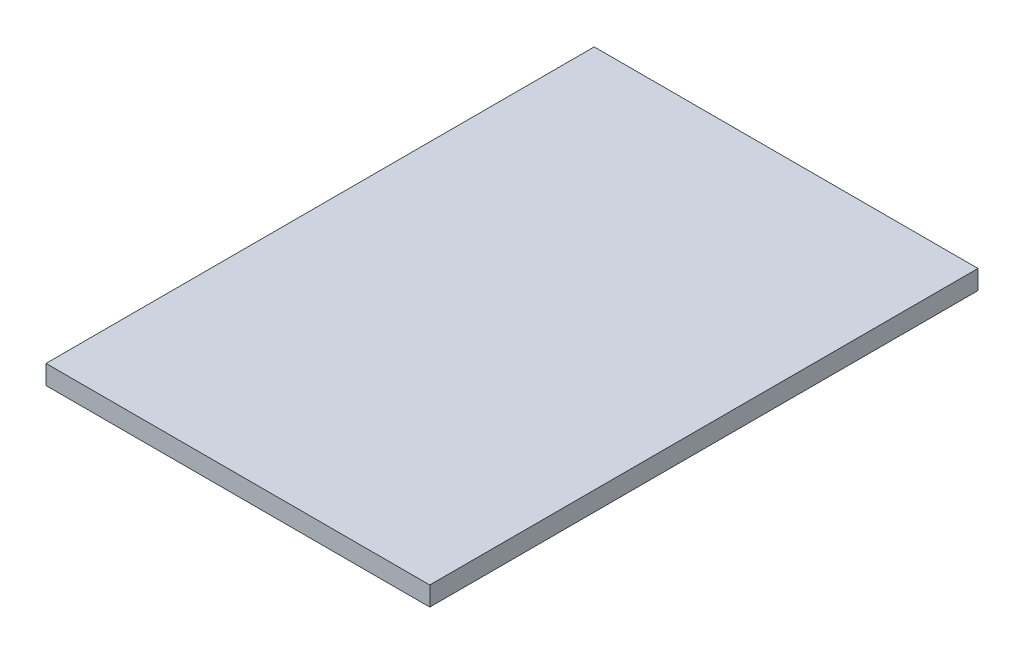
ISO-10303-21;
HEADER;
FILE_DESCRIPTION(('STEP AP214'),'2;1');
FILE_NAME('part.step','',(''),(''),'','','');
FILE_SCHEMA(('AUTOMOTIVE_DESIGN { 1 0 10303 214 1 1 1 1 }'));
ENDSEC;
DATA;
#1=APPLICATION_CONTEXT('core data for automotive mechanical design processes');
#2=APPLICATION_PROTOCOL_DEFINITION('international standard','automotive_design',2000,#1);
#3=PRODUCT_CONTEXT('',#1,'mechanical');
#4=PRODUCT('Part','Part','',(#3));
#5=PRODUCT_RELATED_PRODUCT_CATEGORY('part','',(#4));
#6=PRODUCT_DEFINITION_FORMATION('','',#4);
#7=PRODUCT_DEFINITION_CONTEXT('part definition',#1,'design');
#8=PRODUCT_DEFINITION('design','',#6,#7);
#9=PRODUCT_DEFINITION_SHAPE('','',#8);
#10=(LENGTH_UNIT() NAMED_UNIT(*) SI_UNIT(.MILLI.,.METRE.));
#11=(NAMED_UNIT(*) PLANE_ANGLE_UNIT() SI_UNIT($,.RADIAN.));
#12=(NAMED_UNIT(*) SI_UNIT($,.STERADIAN.) SOLID_ANGLE_UNIT());
#13=UNCERTAINTY_MEASURE_WITH_UNIT(LENGTH_MEASURE(1.E-05),#10,'distance_accuracy_value','');
#14=(GEOMETRIC_REPRESENTATION_CONTEXT(3) GLOBAL_UNCERTAINTY_ASSIGNED_CONTEXT((#13)) GLOBAL_UNIT_ASSIGNED_CONTEXT((#10,
#11,#12)) REPRESENTATION_CONTEXT('',''));
#15=CARTESIAN_POINT('',(0.,0.,0.));
#16=DIRECTION('',(0.,0.,1.));
#17=DIRECTION('',(1.,0.,0.));
#18=AXIS2_PLACEMENT_3D('',#15,#16,#17);
#19=CARTESIAN_POINT('',(700.,70.,1000.));
#20=DIRECTION('',(-1.,0.,0.));
#21=DIRECTION('',(0.,0.,1.));
#22=AXIS2_PLACEMENT_3D('',#19,#20,#21);
#23=PLANE('',#22);
#24=DIRECTION('',(0.,0.,-1.));
#25=VECTOR('',#24,1.);
#26=CARTESIAN_POINT('',(700.,0.,1000.));
#27=LINE('',#26,#25);
#28=CARTESIAN_POINT('',(700.,0.,1000.));
#29=VERTEX_POINT('',#28);
#30=CARTESIAN_POINT('',(700.,0.,-1000.));
#31=VERTEX_POINT('',#30);
#32=EDGE_CURVE('E80',#29,#31,#27,.T.);
#33=ORIENTED_EDGE('',*,*,#32,.T.);
#34=DIRECTION('',(0.,-1.,0.));
#35=VECTOR('',#34,1.);
#36=CARTESIAN_POINT('',(700.,70.,-1000.));
#37=LINE('',#36,#35);
#38=CARTESIAN_POINT('',(700.,70.,-1000.));
#39=VERTEX_POINT('',#38);
#40=EDGE_CURVE('E11',#39,#31,#37,.T.);
#41=ORIENTED_EDGE('',*,*,#40,.F.);
#42=DIRECTION('',(0.,0.,-1.));
#43=VECTOR('',#42,1.);
#44=CARTESIAN_POINT('',(700.,70.,1000.));
#45=LINE('',#44,#43);
#46=CARTESIAN_POINT('',(700.,70.,1000.));
#47=VERTEX_POINT('',#46);
#48=EDGE_CURVE('E68',#47,#39,#45,.T.);
#49=ORIENTED_EDGE('',*,*,#48,.F.);
#50=DIRECTION('',(0.,-1.,0.));
#51=VECTOR('',#50,1.);
#52=CARTESIAN_POINT('',(700.,70.,1000.));
#53=LINE('',#52,#51);
#54=EDGE_CURVE('E76',#47,#29,#53,.T.);
#55=ORIENTED_EDGE('',*,*,#54,.T.);
#56=EDGE_LOOP('',(#33,#41,#49,#55));
#57=FACE_BOUND('',#56,.T.);
#58=ADVANCED_FACE('F17',(#57),#23,.F.);
#59=CARTESIAN_POINT('',(-700.,70.,-1000.));
#60=DIRECTION('',(0.,0.,1.));
#61=DIRECTION('',(1.,0.,0.));
#62=AXIS2_PLACEMENT_3D('',#59,#60,#61);
#63=PLANE('',#62);
#64=DIRECTION('',(-1.,0.,0.));
#65=VECTOR('',#64,1.);
#66=CARTESIAN_POINT('',(-700.,0.,-1000.));
#67=LINE('',#66,#65);
#68=CARTESIAN_POINT('',(-700.,0.,-1000.));
#69=VERTEX_POINT('',#68);
#70=EDGE_CURVE('E72',#31,#69,#67,.T.);
#71=ORIENTED_EDGE('',*,*,#70,.T.);
#72=DIRECTION('',(0.,-1.,0.));
#73=VECTOR('',#72,1.);
#74=CARTESIAN_POINT('',(-700.,70.,-1000.));
#75=LINE('',#74,#73);
#76=CARTESIAN_POINT('',(-700.,70.,-1000.));
#77=VERTEX_POINT('',#76);
#78=EDGE_CURVE('E25',#77,#69,#75,.T.);
#79=ORIENTED_EDGE('',*,*,#78,.F.);
#80=DIRECTION('',(-1.,0.,0.));
#81=VECTOR('',#80,1.);
#82=CARTESIAN_POINT('',(-700.,70.,-1000.));
#83=LINE('',#82,#81);
#84=EDGE_CURVE('E63',#39,#77,#83,.T.);
#85=ORIENTED_EDGE('',*,*,#84,.F.);
#86=ORIENTED_EDGE('',*,*,#40,.T.);
#87=EDGE_LOOP('',(#71,#79,#85,#86));
#88=FACE_BOUND('',#87,.T.);
#89=ADVANCED_FACE('F71',(#88),#63,.F.);
#90=CARTESIAN_POINT('',(-700.,70.,1000.));
#91=DIRECTION('',(1.,0.,0.));
#92=DIRECTION('',(0.,0.,-1.));
#93=AXIS2_PLACEMENT_3D('',#90,#91,#92);
#94=PLANE('',#93);
#95=DIRECTION('',(0.,0.,1.));
#96=VECTOR('',#95,1.);
#97=CARTESIAN_POINT('',(-700.,0.,1000.));
#98=LINE('',#97,#96);
#99=CARTESIAN_POINT('',(-700.,0.,1000.));
#100=VERTEX_POINT('',#99);
#101=EDGE_CURVE('E50',#69,#100,#98,.T.);
#102=ORIENTED_EDGE('',*,*,#101,.T.);
#103=DIRECTION('',(0.,-1.,0.));
#104=VECTOR('',#103,1.);
#105=CARTESIAN_POINT('',(-700.,70.,1000.));
#106=LINE('',#105,#104);
#107=CARTESIAN_POINT('',(-700.,70.,1000.));
#108=VERTEX_POINT('',#107);
#109=EDGE_CURVE('E73',#108,#100,#106,.T.);
#110=ORIENTED_EDGE('',*,*,#109,.F.);
#111=DIRECTION('',(0.,0.,1.));
#112=VECTOR('',#111,1.);
#113=CARTESIAN_POINT('',(-700.,70.,1000.));
#114=LINE('',#113,#112);
#115=EDGE_CURVE('E66',#77,#108,#114,.T.);
#116=ORIENTED_EDGE('',*,*,#115,.F.);
#117=ORIENTED_EDGE('',*,*,#78,.T.);
#118=EDGE_LOOP('',(#102,#110,#116,#117));
#119=FACE_BOUND('',#118,.T.);
#120=ADVANCED_FACE('F74',(#119),#94,.F.);
#121=CARTESIAN_POINT('',(-700.,70.,1000.));
#122=DIRECTION('',(0.,0.,-1.));
#123=DIRECTION('',(-1.,0.,0.));
#124=AXIS2_PLACEMENT_3D('',#121,#122,#123);
#125=PLANE('',#124);
#126=DIRECTION('',(1.,0.,0.));
#127=VECTOR('',#126,1.);
#128=CARTESIAN_POINT('',(-700.,0.,1000.));
#129=LINE('',#128,#127);
#130=EDGE_CURVE('E56',#100,#29,#129,.T.);
#131=ORIENTED_EDGE('',*,*,#130,.T.);
#132=ORIENTED_EDGE('',*,*,#54,.F.);
#133=DIRECTION('',(1.,0.,0.));
#134=VECTOR('',#133,1.);
#135=CARTESIAN_POINT('',(-700.,70.,1000.));
#136=LINE('',#135,#134);
#137=EDGE_CURVE('E33',#108,#47,#136,.T.);
#138=ORIENTED_EDGE('',*,*,#137,.F.);
#139=ORIENTED_EDGE('',*,*,#109,.T.);
#140=EDGE_LOOP('',(#131,#132,#138,#139));
#141=FACE_BOUND('',#140,.T.);
#142=ADVANCED_FACE('F87',(#141),#125,.F.);
#143=CARTESIAN_POINT('',(0.,70.,0.));
#144=DIRECTION('',(0.,-1.,0.));
#145=DIRECTION('',(0.,0.,-1.));
#146=AXIS2_PLACEMENT_3D('',#143,#144,#145);
#147=PLANE('',#146);
#148=ORIENTED_EDGE('',*,*,#48,.T.);
#149=ORIENTED_EDGE('',*,*,#84,.T.);
#150=ORIENTED_EDGE('',*,*,#115,.T.);
#151=ORIENTED_EDGE('',*,*,#137,.T.);
#152=EDGE_LOOP('',(#148,#149,#150,#151));
#153=FACE_BOUND('',#152,.T.);
#154=ADVANCED_FACE('F64',(#153),#147,.F.);
#155=CARTESIAN_POINT('',(0.,0.,0.));
#156=DIRECTION('',(0.,-1.,0.));
#157=DIRECTION('',(0.,0.,-1.));
#158=AXIS2_PLACEMENT_3D('',#155,#156,#157);
#159=PLANE('',#158);
#160=ORIENTED_EDGE('',*,*,#32,.F.);
#161=ORIENTED_EDGE('',*,*,#130,.F.);
#162=ORIENTED_EDGE('',*,*,#101,.F.);
#163=ORIENTED_EDGE('',*,*,#70,.F.);
#164=EDGE_LOOP('',(#160,#161,#162,#163));
#165=FACE_BOUND('',#164,.T.);
#166=ADVANCED_FACE('F90',(#165),#159,.T.);
#167=CLOSED_SHELL('',(#58,#89,#120,#142,#154,#166));
#168=MANIFOLD_SOLID_BREP('B1',#167);
#169=ADVANCED_BREP_SHAPE_REPRESENTATION('',(#18,#168),#14);
#170=SHAPE_DEFINITION_REPRESENTATION(#9,#169);
ENDSEC;
END-ISO-10303-21;
